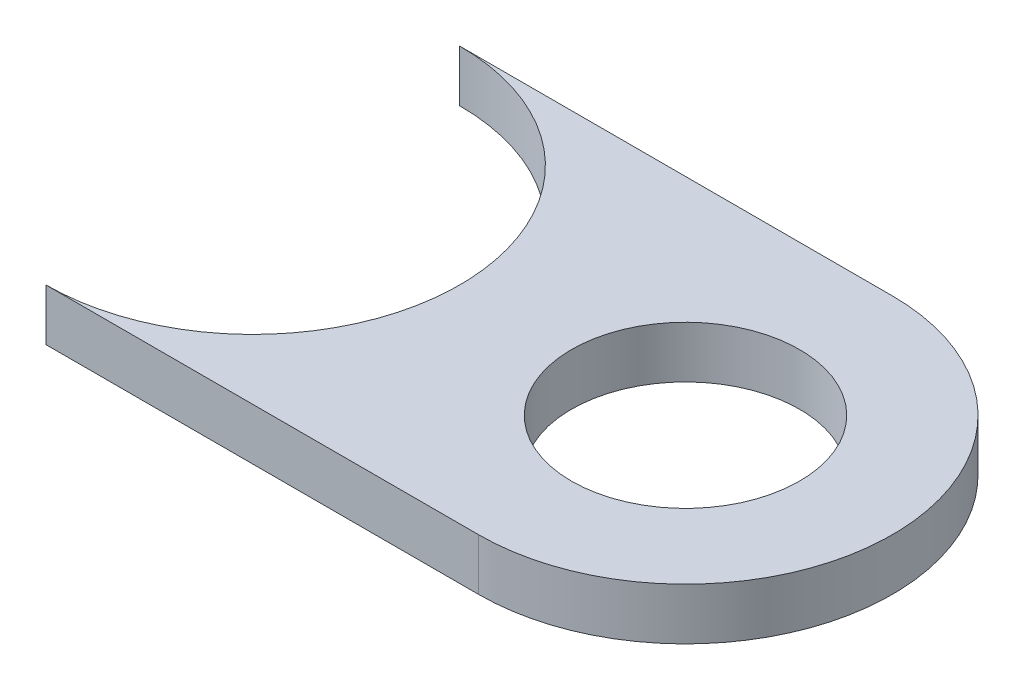
ISO-10303-21;
HEADER;
FILE_DESCRIPTION(('STEP AP214'),'2;1');
FILE_NAME('part.step','',(''),(''),'','','');
FILE_SCHEMA(('AUTOMOTIVE_DESIGN { 1 0 10303 214 1 1 1 1 }'));
ENDSEC;
DATA;
#1=APPLICATION_CONTEXT('core data for automotive mechanical design processes');
#2=APPLICATION_PROTOCOL_DEFINITION('international standard','automotive_design',2000,#1);
#3=PRODUCT_CONTEXT('',#1,'mechanical');
#4=PRODUCT('Part','Part','',(#3));
#5=PRODUCT_RELATED_PRODUCT_CATEGORY('part','',(#4));
#6=PRODUCT_DEFINITION_FORMATION('','',#4);
#7=PRODUCT_DEFINITION_CONTEXT('part definition',#1,'design');
#8=PRODUCT_DEFINITION('design','',#6,#7);
#9=PRODUCT_DEFINITION_SHAPE('','',#8);
#10=(LENGTH_UNIT() NAMED_UNIT(*) SI_UNIT(.MILLI.,.METRE.));
#11=(NAMED_UNIT(*) PLANE_ANGLE_UNIT() SI_UNIT($,.RADIAN.));
#12=(NAMED_UNIT(*) SI_UNIT($,.STERADIAN.) SOLID_ANGLE_UNIT());
#13=UNCERTAINTY_MEASURE_WITH_UNIT(LENGTH_MEASURE(1.E-05),#10,'distance_accuracy_value','');
#14=(GEOMETRIC_REPRESENTATION_CONTEXT(3) GLOBAL_UNCERTAINTY_ASSIGNED_CONTEXT((#13)) GLOBAL_UNIT_ASSIGNED_CONTEXT((#10,
#11,#12)) REPRESENTATION_CONTEXT('',''));
#15=CARTESIAN_POINT('',(0.,0.,0.));
#16=DIRECTION('',(0.,0.,1.));
#17=DIRECTION('',(1.,0.,0.));
#18=AXIS2_PLACEMENT_3D('',#15,#16,#17);
#19=CARTESIAN_POINT('',(-26.56078,3.175,0.));
#20=DIRECTION('',(0.,1.,0.));
#21=DIRECTION('',(0.,0.,1.));
#22=AXIS2_PLACEMENT_3D('',#19,#20,#21);
#23=PLANE('',#22);
#24=CARTESIAN_POINT('',(-26.56078,3.175,0.));
#25=DIRECTION('',(0.,-1.,0.));
#26=DIRECTION('',(0.,0.,1.));
#27=AXIS2_PLACEMENT_3D('',#24,#25,#26);
#28=CIRCLE('',#27,12.7);
#29=CARTESIAN_POINT('',(-26.56078,3.175,-12.7));
#30=VERTEX_POINT('',#29);
#31=CARTESIAN_POINT('',(-26.56078,3.175,12.7));
#32=VERTEX_POINT('',#31);
#33=EDGE_CURVE('E95',#30,#32,#28,.T.);
#34=ORIENTED_EDGE('',*,*,#33,.T.);
#35=DIRECTION('',(1.,0.,0.));
#36=VECTOR('',#35,1.);
#37=CARTESIAN_POINT('',(-26.56078,3.175,12.7));
#38=LINE('',#37,#36);
#39=CARTESIAN_POINT('',(0.,3.175,12.7));
#40=VERTEX_POINT('',#39);
#41=EDGE_CURVE('E90',#32,#40,#38,.T.);
#42=ORIENTED_EDGE('',*,*,#41,.T.);
#43=CARTESIAN_POINT('',(0.,3.175,0.));
#44=DIRECTION('',(0.,1.,0.));
#45=DIRECTION('',(0.,0.,1.));
#46=AXIS2_PLACEMENT_3D('',#43,#44,#45);
#47=CIRCLE('',#46,12.7);
#48=CARTESIAN_POINT('',(0.,3.175,-12.7));
#49=VERTEX_POINT('',#48);
#50=EDGE_CURVE('E93',#40,#49,#47,.T.);
#51=ORIENTED_EDGE('',*,*,#50,.T.);
#52=DIRECTION('',(-1.,0.,0.));
#53=VECTOR('',#52,1.);
#54=CARTESIAN_POINT('',(-26.56078,3.175,-12.7));
#55=LINE('',#54,#53);
#56=EDGE_CURVE('E60',#49,#30,#55,.T.);
#57=ORIENTED_EDGE('',*,*,#56,.T.);
#58=EDGE_LOOP('',(#34,#42,#51,#57));
#59=FACE_BOUND('',#58,.T.);
#60=CARTESIAN_POINT('',(0.,3.175,0.));
#61=DIRECTION('',(0.,1.,0.));
#62=DIRECTION('',(0.,0.,1.));
#63=AXIS2_PLACEMENT_3D('',#60,#61,#62);
#64=CIRCLE('',#63,7.00024);
#65=CARTESIAN_POINT('',(0.,3.175,7.00024));
#66=VERTEX_POINT('',#65);
#67=EDGE_CURVE('E116',#66,#66,#64,.T.);
#68=ORIENTED_EDGE('',*,*,#67,.F.);
#69=EDGE_LOOP('',(#68));
#70=FACE_BOUND('',#69,.T.);
#71=ADVANCED_FACE('F42',(#59,#70),#23,.T.);
#72=CARTESIAN_POINT('',(-26.56078,0.,0.));
#73=DIRECTION('',(0.,1.,0.));
#74=DIRECTION('',(0.,0.,1.));
#75=AXIS2_PLACEMENT_3D('',#72,#73,#74);
#76=PLANE('',#75);
#77=CARTESIAN_POINT('',(-26.56078,0.,0.));
#78=DIRECTION('',(0.,-1.,0.));
#79=DIRECTION('',(0.,0.,1.));
#80=AXIS2_PLACEMENT_3D('',#77,#78,#79);
#81=CIRCLE('',#80,12.7);
#82=CARTESIAN_POINT('',(-26.56078,0.,-12.7));
#83=VERTEX_POINT('',#82);
#84=CARTESIAN_POINT('',(-26.56078,0.,12.7));
#85=VERTEX_POINT('',#84);
#86=EDGE_CURVE('E112',#83,#85,#81,.T.);
#87=ORIENTED_EDGE('',*,*,#86,.F.);
#88=DIRECTION('',(-1.,0.,0.));
#89=VECTOR('',#88,1.);
#90=CARTESIAN_POINT('',(-26.56078,0.,-12.7));
#91=LINE('',#90,#89);
#92=CARTESIAN_POINT('',(0.,0.,-12.7));
#93=VERTEX_POINT('',#92);
#94=EDGE_CURVE('E83',#93,#83,#91,.T.);
#95=ORIENTED_EDGE('',*,*,#94,.F.);
#96=CARTESIAN_POINT('',(0.,0.,0.));
#97=DIRECTION('',(0.,1.,0.));
#98=DIRECTION('',(0.,0.,1.));
#99=AXIS2_PLACEMENT_3D('',#96,#97,#98);
#100=CIRCLE('',#99,12.7);
#101=CARTESIAN_POINT('',(0.,0.,12.7));
#102=VERTEX_POINT('',#101);
#103=EDGE_CURVE('E77',#102,#93,#100,.T.);
#104=ORIENTED_EDGE('',*,*,#103,.F.);
#105=DIRECTION('',(1.,0.,0.));
#106=VECTOR('',#105,1.);
#107=CARTESIAN_POINT('',(-26.56078,0.,12.7));
#108=LINE('',#107,#106);
#109=EDGE_CURVE('E100',#85,#102,#108,.T.);
#110=ORIENTED_EDGE('',*,*,#109,.F.);
#111=EDGE_LOOP('',(#87,#95,#104,#110));
#112=FACE_BOUND('',#111,.T.);
#113=CARTESIAN_POINT('',(0.,0.,0.));
#114=DIRECTION('',(0.,1.,0.));
#115=DIRECTION('',(0.,0.,1.));
#116=AXIS2_PLACEMENT_3D('',#113,#114,#115);
#117=CIRCLE('',#116,7.00024);
#118=CARTESIAN_POINT('',(0.,0.,7.00024));
#119=VERTEX_POINT('',#118);
#120=EDGE_CURVE('E136',#119,#119,#117,.T.);
#121=ORIENTED_EDGE('',*,*,#120,.T.);
#122=EDGE_LOOP('',(#121));
#123=FACE_BOUND('',#122,.T.);
#124=ADVANCED_FACE('F130',(#112,#123),#76,.F.);
#125=CARTESIAN_POINT('',(-26.56078,3.175,0.));
#126=DIRECTION('',(0.,-1.,0.));
#127=DIRECTION('',(0.,0.,-1.));
#128=AXIS2_PLACEMENT_3D('',#125,#126,#127);
#129=CYLINDRICAL_SURFACE('',#128,12.7);
#130=ORIENTED_EDGE('',*,*,#86,.T.);
#131=DIRECTION('',(0.,-1.,0.));
#132=VECTOR('',#131,1.);
#133=CARTESIAN_POINT('',(-26.56078,3.175,12.7));
#134=LINE('',#133,#132);
#135=EDGE_CURVE('E11',#32,#85,#134,.T.);
#136=ORIENTED_EDGE('',*,*,#135,.F.);
#137=ORIENTED_EDGE('',*,*,#33,.F.);
#138=DIRECTION('',(0.,-1.,0.));
#139=VECTOR('',#138,1.);
#140=CARTESIAN_POINT('',(-26.56078,3.175,-12.7));
#141=LINE('',#140,#139);
#142=EDGE_CURVE('E108',#30,#83,#141,.T.);
#143=ORIENTED_EDGE('',*,*,#142,.T.);
#144=EDGE_LOOP('',(#130,#136,#137,#143));
#145=FACE_BOUND('',#144,.T.);
#146=ADVANCED_FACE('F44',(#145),#129,.F.);
#147=CARTESIAN_POINT('',(-26.56078,3.175,12.7));
#148=DIRECTION('',(0.,0.,-1.));
#149=DIRECTION('',(-1.,0.,0.));
#150=AXIS2_PLACEMENT_3D('',#147,#148,#149);
#151=PLANE('',#150);
#152=ORIENTED_EDGE('',*,*,#109,.T.);
#153=DIRECTION('',(0.,-1.,0.));
#154=VECTOR('',#153,1.);
#155=CARTESIAN_POINT('',(0.,3.175,12.7));
#156=LINE('',#155,#154);
#157=EDGE_CURVE('E52',#40,#102,#156,.T.);
#158=ORIENTED_EDGE('',*,*,#157,.F.);
#159=ORIENTED_EDGE('',*,*,#41,.F.);
#160=ORIENTED_EDGE('',*,*,#135,.T.);
#161=EDGE_LOOP('',(#152,#158,#159,#160));
#162=FACE_BOUND('',#161,.T.);
#163=ADVANCED_FACE('F99',(#162),#151,.F.);
#164=CARTESIAN_POINT('',(0.,3.175,0.));
#165=DIRECTION('',(0.,-1.,0.));
#166=DIRECTION('',(0.,0.,-1.));
#167=AXIS2_PLACEMENT_3D('',#164,#165,#166);
#168=CYLINDRICAL_SURFACE('',#167,12.7);
#169=ORIENTED_EDGE('',*,*,#103,.T.);
#170=DIRECTION('',(0.,-1.,0.));
#171=VECTOR('',#170,1.);
#172=CARTESIAN_POINT('',(0.,3.175,-12.7));
#173=LINE('',#172,#171);
#174=EDGE_CURVE('E102',#49,#93,#173,.T.);
#175=ORIENTED_EDGE('',*,*,#174,.F.);
#176=ORIENTED_EDGE('',*,*,#50,.F.);
#177=ORIENTED_EDGE('',*,*,#157,.T.);
#178=EDGE_LOOP('',(#169,#175,#176,#177));
#179=FACE_BOUND('',#178,.T.);
#180=ADVANCED_FACE('F103',(#179),#168,.T.);
#181=CARTESIAN_POINT('',(-26.56078,3.175,-12.7));
#182=DIRECTION('',(0.,0.,1.));
#183=DIRECTION('',(1.,0.,0.));
#184=AXIS2_PLACEMENT_3D('',#181,#182,#183);
#185=PLANE('',#184);
#186=ORIENTED_EDGE('',*,*,#94,.T.);
#187=ORIENTED_EDGE('',*,*,#142,.F.);
#188=ORIENTED_EDGE('',*,*,#56,.F.);
#189=ORIENTED_EDGE('',*,*,#174,.T.);
#190=EDGE_LOOP('',(#186,#187,#188,#189));
#191=FACE_BOUND('',#190,.T.);
#192=ADVANCED_FACE('F127',(#191),#185,.F.);
#193=CARTESIAN_POINT('',(0.,3.175,0.));
#194=DIRECTION('',(0.,-1.,0.));
#195=DIRECTION('',(0.,0.,-1.));
#196=AXIS2_PLACEMENT_3D('',#193,#194,#195);
#197=CYLINDRICAL_SURFACE('',#196,7.00024);
#198=ORIENTED_EDGE('',*,*,#67,.T.);
#199=EDGE_LOOP('',(#198));
#200=FACE_BOUND('',#199,.T.);
#201=ORIENTED_EDGE('',*,*,#120,.F.);
#202=EDGE_LOOP('',(#201));
#203=FACE_BOUND('',#202,.T.);
#204=ADVANCED_FACE('F145',(#200,#203),#197,.F.);
#205=CLOSED_SHELL('',(#71,#124,#146,#163,#180,#192,#204));
#206=MANIFOLD_SOLID_BREP('B2',#205);
#207=ADVANCED_BREP_SHAPE_REPRESENTATION('',(#18,#206),#14);
#208=SHAPE_DEFINITION_REPRESENTATION(#9,#207);
ENDSEC;
END-ISO-10303-21;
